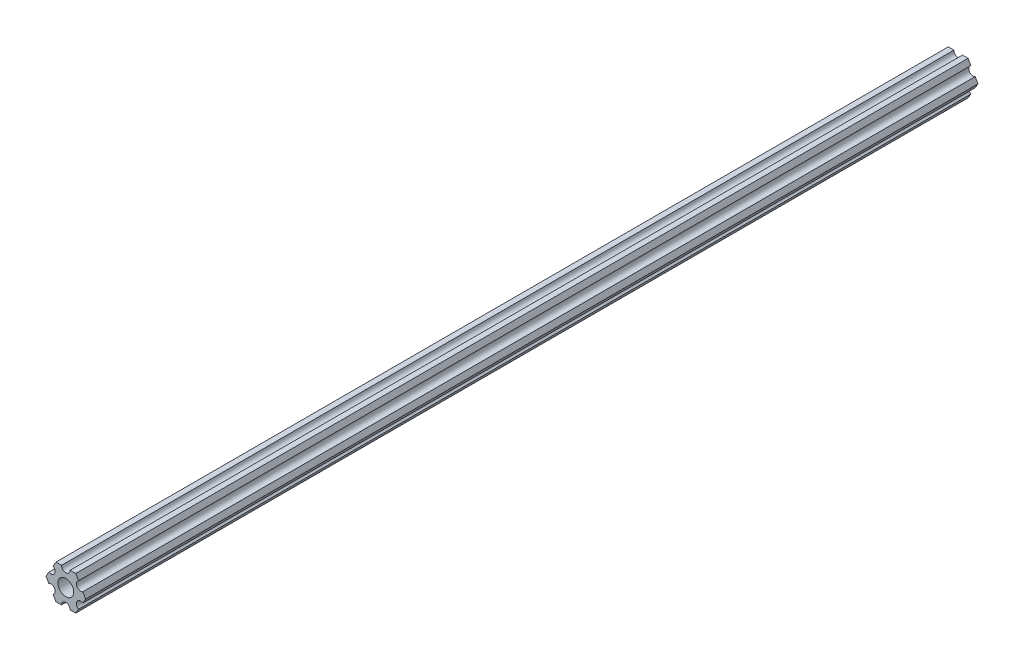
ISO-10303-21;
HEADER;
FILE_DESCRIPTION(('STEP AP214'),'2;1');
FILE_NAME('part.step','',(''),(''),'','','');
FILE_SCHEMA(('AUTOMOTIVE_DESIGN { 1 0 10303 214 1 1 1 1 }'));
ENDSEC;
DATA;
#1=APPLICATION_CONTEXT('core data for automotive mechanical design processes');
#2=APPLICATION_PROTOCOL_DEFINITION('international standard','automotive_design',2000,#1);
#3=PRODUCT_CONTEXT('',#1,'mechanical');
#4=PRODUCT('Part','Part','',(#3));
#5=PRODUCT_RELATED_PRODUCT_CATEGORY('part','',(#4));
#6=PRODUCT_DEFINITION_FORMATION('','',#4);
#7=PRODUCT_DEFINITION_CONTEXT('part definition',#1,'design');
#8=PRODUCT_DEFINITION('design','',#6,#7);
#9=PRODUCT_DEFINITION_SHAPE('','',#8);
#10=(LENGTH_UNIT() NAMED_UNIT(*) SI_UNIT(.MILLI.,.METRE.));
#11=(NAMED_UNIT(*) PLANE_ANGLE_UNIT() SI_UNIT($,.RADIAN.));
#12=(NAMED_UNIT(*) SI_UNIT($,.STERADIAN.) SOLID_ANGLE_UNIT());
#13=UNCERTAINTY_MEASURE_WITH_UNIT(LENGTH_MEASURE(1.E-05),#10,'distance_accuracy_value','');
#14=(GEOMETRIC_REPRESENTATION_CONTEXT(3) GLOBAL_UNCERTAINTY_ASSIGNED_CONTEXT((#13)) GLOBAL_UNIT_ASSIGNED_CONTEXT((#10,
#11,#12)) REPRESENTATION_CONTEXT('',''));
#15=CARTESIAN_POINT('',(0.,0.,0.));
#16=DIRECTION('',(0.,0.,1.));
#17=DIRECTION('',(1.,0.,0.));
#18=AXIS2_PLACEMENT_3D('',#15,#16,#17);
#19=CARTESIAN_POINT('',(3.66617459405346,-6.34999977789375,304.8));
#20=DIRECTION('',(-0.86602543407573,0.499999947533941,0.));
#21=DIRECTION('',(0.,0.,1.));
#22=AXIS2_PLACEMENT_3D('',#19,#20,#21);
#23=PLANE('',#22);
#24=DIRECTION('',(-0.499999947533941,-0.86602543407573,0.));
#25=VECTOR('',#24,1.);
#26=CARTESIAN_POINT('',(3.66617459405346,-6.34999977789375,292.1));
#27=LINE('',#26,#25);
#28=CARTESIAN_POINT('',(4.70551158967065,-4.54981504343587,292.1));
#29=VERTEX_POINT('',#28);
#30=CARTESIAN_POINT('',(3.66617459405348,-6.34999977789375,292.1));
#31=VERTEX_POINT('',#30);
#32=EDGE_CURVE('E395',#29,#31,#27,.T.);
#33=ORIENTED_EDGE('',*,*,#32,.F.);
#34=DIRECTION('',(0.,0.,-1.));
#35=VECTOR('',#34,1.);
#36=CARTESIAN_POINT('',(4.70551158967065,-4.54981504343587,304.8));
#37=LINE('',#36,#35);
#38=CARTESIAN_POINT('',(4.70551158967065,-4.54981504343587,622.3));
#39=VERTEX_POINT('',#38);
#40=EDGE_CURVE('E318',#39,#29,#37,.T.);
#41=ORIENTED_EDGE('',*,*,#40,.F.);
#42=DIRECTION('',(0.499999947533941,0.86602543407573,0.));
#43=VECTOR('',#42,1.);
#44=CARTESIAN_POINT('',(3.66617459405346,-6.34999977789375,622.3));
#45=LINE('',#44,#43);
#46=CARTESIAN_POINT('',(3.66617459405348,-6.34999977789375,622.3));
#47=VERTEX_POINT('',#46);
#48=EDGE_CURVE('E284',#47,#39,#45,.T.);
#49=ORIENTED_EDGE('',*,*,#48,.F.);
#50=DIRECTION('',(0.,0.,-1.));
#51=VECTOR('',#50,1.);
#52=CARTESIAN_POINT('',(3.66617459405346,-6.34999977789375,304.8));
#53=LINE('',#52,#51);
#54=EDGE_CURVE('E234',#47,#31,#53,.T.);
#55=ORIENTED_EDGE('',*,*,#54,.T.);
#56=EDGE_LOOP('',(#33,#41,#49,#55));
#57=FACE_BOUND('',#56,.T.);
#58=ADVANCED_FACE('F42',(#57),#23,.F.);
#59=CARTESIAN_POINT('',(1.58750038469926,-6.34999990382518,304.8));
#60=DIRECTION('',(-6.05825721258438E-08,1.,0.));
#61=DIRECTION('',(0.,0.,1.));
#62=AXIS2_PLACEMENT_3D('',#59,#60,#61);
#63=PLANE('',#62);
#64=DIRECTION('',(-0.999999999999998,-6.05825721258437E-08,0.));
#65=VECTOR('',#64,1.);
#66=CARTESIAN_POINT('',(1.58750038469926,-6.34999990382518,292.1));
#67=LINE('',#66,#65);
#68=CARTESIAN_POINT('',(1.58750038469926,-6.34999990382518,292.1));
#69=VERTEX_POINT('',#68);
#70=EDGE_CURVE('E394',#31,#69,#67,.T.);
#71=ORIENTED_EDGE('',*,*,#70,.F.);
#72=ORIENTED_EDGE('',*,*,#54,.F.);
#73=DIRECTION('',(0.999999999999998,6.05825721258437E-08,0.));
#74=VECTOR('',#73,1.);
#75=CARTESIAN_POINT('',(1.58750038469926,-6.34999990382518,622.3));
#76=LINE('',#75,#74);
#77=CARTESIAN_POINT('',(1.58750038469926,-6.35,622.3));
#78=VERTEX_POINT('',#77);
#79=EDGE_CURVE('E263',#78,#47,#76,.T.);
#80=ORIENTED_EDGE('',*,*,#79,.F.);
#81=DIRECTION('',(0.,0.,-1.));
#82=VECTOR('',#81,1.);
#83=CARTESIAN_POINT('',(1.58750038469926,-6.34999990382518,304.8));
#84=LINE('',#83,#82);
#85=EDGE_CURVE('E231',#78,#69,#84,.T.);
#86=ORIENTED_EDGE('',*,*,#85,.T.);
#87=EDGE_LOOP('',(#71,#72,#80,#86));
#88=FACE_BOUND('',#87,.T.);
#89=ADVANCED_FACE('F355',(#88),#63,.F.);
#90=CARTESIAN_POINT('',(3.8469926204343E-07,-6.35,304.8));
#91=DIRECTION('',(0.,0.,-1.));
#92=DIRECTION('',(-1.,0.,0.));
#93=AXIS2_PLACEMENT_3D('',#90,#91,#92);
#94=CYLINDRICAL_SURFACE('',#93,1.5875);
#95=CARTESIAN_POINT('',(3.8469926204343E-07,-6.35,292.1));
#96=DIRECTION('',(0.,0.,-1.));
#97=DIRECTION('',(-1.,0.,0.));
#98=AXIS2_PLACEMENT_3D('',#95,#96,#97);
#99=CIRCLE('',#98,1.5875);
#100=CARTESIAN_POINT('',(-1.58749961530074,-6.35000009617482,292.1));
#101=VERTEX_POINT('',#100);
#102=EDGE_CURVE('E268',#69,#101,#99,.F.);
#103=ORIENTED_EDGE('',*,*,#102,.F.);
#104=ORIENTED_EDGE('',*,*,#85,.F.);
#105=CARTESIAN_POINT('',(3.8469926204343E-07,-6.35,622.3));
#106=DIRECTION('',(0.,0.,1.));
#107=DIRECTION('',(1.,0.,0.));
#108=AXIS2_PLACEMENT_3D('',#105,#106,#107);
#109=CIRCLE('',#108,1.5875);
#110=CARTESIAN_POINT('',(-1.58749961530074,-6.35000009617482,622.3));
#111=VERTEX_POINT('',#110);
#112=EDGE_CURVE('E309',#111,#78,#109,.F.);
#113=ORIENTED_EDGE('',*,*,#112,.F.);
#114=DIRECTION('',(0.,0.,-1.));
#115=VECTOR('',#114,1.);
#116=CARTESIAN_POINT('',(-1.58749961530073,-6.35000009617482,304.8));
#117=LINE('',#116,#115);
#118=EDGE_CURVE('E228',#111,#101,#117,.T.);
#119=ORIENTED_EDGE('',*,*,#118,.T.);
#120=EDGE_LOOP('',(#103,#104,#113,#119));
#121=FACE_BOUND('',#120,.T.);
#122=ADVANCED_FACE('F361',(#121),#94,.F.);
#123=CARTESIAN_POINT('',(-3.66617382465481,-6.35000022210628,304.8));
#124=DIRECTION('',(-6.05825854783851E-08,1.,0.));
#125=DIRECTION('',(0.,0.,1.));
#126=AXIS2_PLACEMENT_3D('',#123,#124,#125);
#127=PLANE('',#126);
#128=DIRECTION('',(-0.999999999999998,-6.0582585478385E-08,0.));
#129=VECTOR('',#128,1.);
#130=CARTESIAN_POINT('',(-3.66617382465481,-6.35000022210628,292.1));
#131=LINE('',#130,#129);
#132=CARTESIAN_POINT('',(-3.6661738246548,-6.35000022210629,292.1));
#133=VERTEX_POINT('',#132);
#134=EDGE_CURVE('E273',#101,#133,#131,.T.);
#135=ORIENTED_EDGE('',*,*,#134,.F.);
#136=ORIENTED_EDGE('',*,*,#118,.F.);
#137=DIRECTION('',(0.999999999999998,6.0582585478385E-08,0.));
#138=VECTOR('',#137,1.);
#139=CARTESIAN_POINT('',(-3.66617382465481,-6.35000022210628,622.3));
#140=LINE('',#139,#138);
#141=CARTESIAN_POINT('',(-3.6661738246548,-6.35000022210629,622.3));
#142=VERTEX_POINT('',#141);
#143=EDGE_CURVE('E307',#142,#111,#140,.T.);
#144=ORIENTED_EDGE('',*,*,#143,.F.);
#145=DIRECTION('',(0.,0.,-1.));
#146=VECTOR('',#145,1.);
#147=CARTESIAN_POINT('',(-3.66617382465481,-6.35000022210628,304.8));
#148=LINE('',#147,#146);
#149=EDGE_CURVE('E225',#142,#133,#148,.T.);
#150=ORIENTED_EDGE('',*,*,#149,.T.);
#151=EDGE_LOOP('',(#135,#136,#144,#150));
#152=FACE_BOUND('',#151,.T.);
#153=ADVANCED_FACE('F372',(#152),#127,.F.);
#154=CARTESIAN_POINT('',(-4.70551103839172,-4.54981561357972,304.8));
#155=DIRECTION('',(0.866025373493152,0.500000052466045,0.));
#156=DIRECTION('',(0.,0.,-1.));
#157=AXIS2_PLACEMENT_3D('',#154,#155,#156);
#158=PLANE('',#157);
#159=DIRECTION('',(-0.500000052466045,0.866025373493152,0.));
#160=VECTOR('',#159,1.);
#161=CARTESIAN_POINT('',(-4.70551103839172,-4.54981561357972,292.1));
#162=LINE('',#161,#160);
#163=CARTESIAN_POINT('',(-4.70551103839172,-4.54981561357972,292.1));
#164=VERTEX_POINT('',#163);
#165=EDGE_CURVE('E277',#133,#164,#162,.T.);
#166=ORIENTED_EDGE('',*,*,#165,.F.);
#167=ORIENTED_EDGE('',*,*,#149,.F.);
#168=DIRECTION('',(0.500000052466045,-0.866025373493152,0.));
#169=VECTOR('',#168,1.);
#170=CARTESIAN_POINT('',(-4.70551103839172,-4.54981561357972,622.3));
#171=LINE('',#170,#169);
#172=CARTESIAN_POINT('',(-4.70551103839172,-4.54981561357972,622.3));
#173=VERTEX_POINT('',#172);
#174=EDGE_CURVE('E305',#173,#142,#171,.T.);
#175=ORIENTED_EDGE('',*,*,#174,.F.);
#176=DIRECTION('',(0.,0.,-1.));
#177=VECTOR('',#176,1.);
#178=CARTESIAN_POINT('',(-4.70551103839172,-4.54981561357972,304.8));
#179=LINE('',#178,#177);
#180=EDGE_CURVE('E217',#173,#164,#179,.T.);
#181=ORIENTED_EDGE('',*,*,#180,.T.);
#182=EDGE_LOOP('',(#166,#167,#175,#181));
#183=FACE_BOUND('',#182,.T.);
#184=ADVANCED_FACE('F44',(#183),#158,.F.);
#185=CARTESIAN_POINT('',(-5.49926112168156,-3.17500033315934,304.8));
#186=DIRECTION('',(0.,0.,-1.));
#187=DIRECTION('',(-1.,0.,0.));
#188=AXIS2_PLACEMENT_3D('',#185,#186,#187);
#189=CYLINDRICAL_SURFACE('',#188,1.5875);
#190=CARTESIAN_POINT('',(-5.49926112168156,-3.17500033315934,292.1));
#191=DIRECTION('',(0.,0.,-1.));
#192=DIRECTION('',(-1.,0.,0.));
#193=AXIS2_PLACEMENT_3D('',#190,#191,#192);
#194=CIRCLE('',#193,1.5875);
#195=CARTESIAN_POINT('',(-6.29301120497142,-1.80018505273897,292.1));
#196=VERTEX_POINT('',#195);
#197=EDGE_CURVE('E196',#164,#196,#194,.F.);
#198=ORIENTED_EDGE('',*,*,#197,.F.);
#199=ORIENTED_EDGE('',*,*,#180,.F.);
#200=CARTESIAN_POINT('',(-5.49926112168156,-3.17500033315934,622.3));
#201=DIRECTION('',(0.,0.,1.));
#202=DIRECTION('',(1.,0.,0.));
#203=AXIS2_PLACEMENT_3D('',#200,#201,#202);
#204=CIRCLE('',#203,1.5875);
#205=CARTESIAN_POINT('',(-6.29301120497142,-1.80018505273897,622.3));
#206=VERTEX_POINT('',#205);
#207=EDGE_CURVE('E303',#206,#173,#204,.F.);
#208=ORIENTED_EDGE('',*,*,#207,.F.);
#209=DIRECTION('',(0.,0.,-1.));
#210=VECTOR('',#209,1.);
#211=CARTESIAN_POINT('',(-6.29301120497141,-1.80018505273897,304.8));
#212=LINE('',#211,#210);
#213=EDGE_CURVE('E215',#206,#196,#212,.T.);
#214=ORIENTED_EDGE('',*,*,#213,.T.);
#215=EDGE_LOOP('',(#198,#199,#208,#214));
#216=FACE_BOUND('',#215,.T.);
#217=ADVANCED_FACE('F379',(#216),#189,.F.);
#218=CARTESIAN_POINT('',(-7.33234841870827,-4.44212523790841E-07,304.8));
#219=DIRECTION('',(0.866025373493151,0.500000052466045,0.));
#220=DIRECTION('',(0.,0.,-1.));
#221=AXIS2_PLACEMENT_3D('',#218,#219,#220);
#222=PLANE('',#221);
#223=DIRECTION('',(-0.500000052466045,0.866025373493151,0.));
#224=VECTOR('',#223,1.);
#225=CARTESIAN_POINT('',(-7.33234841870827,-4.44212523790841E-07,292.1));
#226=LINE('',#225,#224);
#227=CARTESIAN_POINT('',(-7.33234841870827,-4.44212537413502E-07,292.1));
#228=VERTEX_POINT('',#227);
#229=EDGE_CURVE('E190',#196,#228,#226,.T.);
#230=ORIENTED_EDGE('',*,*,#229,.F.);
#231=ORIENTED_EDGE('',*,*,#213,.F.);
#232=DIRECTION('',(0.500000052466045,-0.866025373493151,0.));
#233=VECTOR('',#232,1.);
#234=CARTESIAN_POINT('',(-7.33234841870827,-4.44212523790841E-07,622.3));
#235=LINE('',#234,#233);
#236=CARTESIAN_POINT('',(-7.33234841870827,-4.44212537413502E-07,622.3));
#237=VERTEX_POINT('',#236);
#238=EDGE_CURVE('E214',#237,#206,#235,.T.);
#239=ORIENTED_EDGE('',*,*,#238,.F.);
#240=DIRECTION('',(0.,0.,-1.));
#241=VECTOR('',#240,1.);
#242=CARTESIAN_POINT('',(-7.33234841870827,-4.44212523790841E-07,304.8));
#243=LINE('',#242,#241);
#244=EDGE_CURVE('E207',#237,#228,#243,.T.);
#245=ORIENTED_EDGE('',*,*,#244,.T.);
#246=EDGE_LOOP('',(#230,#231,#239,#245));
#247=FACE_BOUND('',#246,.T.);
#248=ADVANCED_FACE('F213',(#247),#222,.F.);
#249=CARTESIAN_POINT('',(-6.29301142309098,1.80018429024547,304.8));
#250=DIRECTION('',(0.866025434075724,-0.499999947533952,0.));
#251=DIRECTION('',(0.,0.,-1.));
#252=AXIS2_PLACEMENT_3D('',#249,#250,#251);
#253=PLANE('',#252);
#254=DIRECTION('',(0.499999947533952,0.866025434075724,0.));
#255=VECTOR('',#254,1.);
#256=CARTESIAN_POINT('',(-6.29301142309098,1.80018429024547,292.1));
#257=LINE('',#256,#255);
#258=CARTESIAN_POINT('',(-6.29301142309098,1.80018429024547,292.1));
#259=VERTEX_POINT('',#258);
#260=EDGE_CURVE('E193',#228,#259,#257,.T.);
#261=ORIENTED_EDGE('',*,*,#260,.F.);
#262=ORIENTED_EDGE('',*,*,#244,.F.);
#263=DIRECTION('',(-0.499999947533952,-0.866025434075724,0.));
#264=VECTOR('',#263,1.);
#265=CARTESIAN_POINT('',(-6.29301142309098,1.80018429024547,622.3));
#266=LINE('',#265,#264);
#267=CARTESIAN_POINT('',(-6.29301142309098,1.80018429024547,622.3));
#268=VERTEX_POINT('',#267);
#269=EDGE_CURVE('E300',#268,#237,#266,.T.);
#270=ORIENTED_EDGE('',*,*,#269,.F.);
#271=DIRECTION('',(0.,0.,-1.));
#272=VECTOR('',#271,1.);
#273=CARTESIAN_POINT('',(-6.29301142309098,1.80018429024547,304.8));
#274=LINE('',#273,#272);
#275=EDGE_CURVE('E209',#268,#259,#274,.T.);
#276=ORIENTED_EDGE('',*,*,#275,.T.);
#277=EDGE_LOOP('',(#261,#262,#270,#276));
#278=FACE_BOUND('',#277,.T.);
#279=ADVANCED_FACE('F205',(#278),#253,.F.);
#280=CARTESIAN_POINT('',(-5.49926150638082,3.17499966684067,304.8));
#281=DIRECTION('',(0.,0.,-1.));
#282=DIRECTION('',(-1.,0.,0.));
#283=AXIS2_PLACEMENT_3D('',#280,#281,#282);
#284=CYLINDRICAL_SURFACE('',#283,1.5875);
#285=CARTESIAN_POINT('',(-5.49926150638082,3.17499966684067,292.1));
#286=DIRECTION('',(0.,0.,-1.));
#287=DIRECTION('',(-1.,0.,0.));
#288=AXIS2_PLACEMENT_3D('',#285,#286,#287);
#289=CIRCLE('',#288,1.5875);
#290=CARTESIAN_POINT('',(-4.70551158967065,4.54981504343587,292.1));
#291=VERTEX_POINT('',#290);
#292=EDGE_CURVE('E210',#259,#291,#289,.F.);
#293=ORIENTED_EDGE('',*,*,#292,.F.);
#294=ORIENTED_EDGE('',*,*,#275,.F.);
#295=CARTESIAN_POINT('',(-5.49926150638082,3.17499966684067,622.3));
#296=DIRECTION('',(0.,0.,1.));
#297=DIRECTION('',(1.,0.,0.));
#298=AXIS2_PLACEMENT_3D('',#295,#296,#297);
#299=CIRCLE('',#298,1.5875);
#300=CARTESIAN_POINT('',(-4.70551158967065,4.54981504343587,622.3));
#301=VERTEX_POINT('',#300);
#302=EDGE_CURVE('E298',#301,#268,#299,.F.);
#303=ORIENTED_EDGE('',*,*,#302,.F.);
#304=DIRECTION('',(0.,0.,-1.));
#305=VECTOR('',#304,1.);
#306=CARTESIAN_POINT('',(-4.70551158967065,4.54981504343587,304.8));
#307=LINE('',#306,#305);
#308=EDGE_CURVE('E219',#301,#291,#307,.T.);
#309=ORIENTED_EDGE('',*,*,#308,.T.);
#310=EDGE_LOOP('',(#293,#294,#303,#309));
#311=FACE_BOUND('',#310,.T.);
#312=ADVANCED_FACE('F444',(#311),#284,.F.);
#313=CARTESIAN_POINT('',(-3.66617459405349,6.3499997778937,304.8));
#314=DIRECTION('',(0.866025434075729,-0.499999947533942,0.));
#315=DIRECTION('',(0.,0.,-1.));
#316=AXIS2_PLACEMENT_3D('',#313,#314,#315);
#317=PLANE('',#316);
#318=DIRECTION('',(0.499999947533942,0.866025434075729,0.));
#319=VECTOR('',#318,1.);
#320=CARTESIAN_POINT('',(-3.66617459405349,6.3499997778937,292.1));
#321=LINE('',#320,#319);
#322=CARTESIAN_POINT('',(-3.66617459405357,6.3499997778937,292.1));
#323=VERTEX_POINT('',#322);
#324=EDGE_CURVE('E442',#291,#323,#321,.T.);
#325=ORIENTED_EDGE('',*,*,#324,.F.);
#326=ORIENTED_EDGE('',*,*,#308,.F.);
#327=DIRECTION('',(-0.499999947533942,-0.866025434075729,0.));
#328=VECTOR('',#327,1.);
#329=CARTESIAN_POINT('',(-3.66617459405349,6.3499997778937,622.3));
#330=LINE('',#329,#328);
#331=CARTESIAN_POINT('',(-3.66617459405357,6.3499997778937,622.3));
#332=VERTEX_POINT('',#331);
#333=EDGE_CURVE('E296',#332,#301,#330,.T.);
#334=ORIENTED_EDGE('',*,*,#333,.F.);
#335=DIRECTION('',(0.,0.,-1.));
#336=VECTOR('',#335,1.);
#337=CARTESIAN_POINT('',(-3.66617459405349,6.3499997778937,304.8));
#338=LINE('',#337,#336);
#339=EDGE_CURVE('E312',#332,#323,#338,.T.);
#340=ORIENTED_EDGE('',*,*,#339,.T.);
#341=EDGE_LOOP('',(#325,#326,#334,#340));
#342=FACE_BOUND('',#341,.T.);
#343=ADVANCED_FACE('F441',(#342),#317,.F.);
#344=CARTESIAN_POINT('',(-1.58750038469926,6.34999990382518,304.8));
#345=DIRECTION('',(6.05825963273174E-08,-1.,0.));
#346=DIRECTION('',(0.,0.,-1.));
#347=AXIS2_PLACEMENT_3D('',#344,#345,#346);
#348=PLANE('',#347);
#349=DIRECTION('',(0.999999999999998,6.05825963273173E-08,0.));
#350=VECTOR('',#349,1.);
#351=CARTESIAN_POINT('',(-1.58750038469926,6.34999990382518,292.1));
#352=LINE('',#351,#350);
#353=CARTESIAN_POINT('',(-1.58750038469926,6.35,292.1));
#354=VERTEX_POINT('',#353);
#355=EDGE_CURVE('E435',#323,#354,#352,.T.);
#356=ORIENTED_EDGE('',*,*,#355,.F.);
#357=ORIENTED_EDGE('',*,*,#339,.F.);
#358=DIRECTION('',(-0.999999999999998,-6.05825963273173E-08,0.));
#359=VECTOR('',#358,1.);
#360=CARTESIAN_POINT('',(-1.58750038469926,6.34999990382518,622.3));
#361=LINE('',#360,#359);
#362=CARTESIAN_POINT('',(-1.58750038469926,6.34999990382519,622.3));
#363=VERTEX_POINT('',#362);
#364=EDGE_CURVE('E294',#363,#332,#361,.T.);
#365=ORIENTED_EDGE('',*,*,#364,.F.);
#366=DIRECTION('',(0.,0.,-1.));
#367=VECTOR('',#366,1.);
#368=CARTESIAN_POINT('',(-1.58750038469926,6.34999990382519,304.8));
#369=LINE('',#368,#367);
#370=EDGE_CURVE('E315',#363,#354,#369,.T.);
#371=ORIENTED_EDGE('',*,*,#370,.T.);
#372=EDGE_LOOP('',(#356,#357,#365,#371));
#373=FACE_BOUND('',#372,.T.);
#374=ADVANCED_FACE('F433',(#373),#348,.F.);
#375=CARTESIAN_POINT('',(-3.84699260060323E-07,6.35,304.8));
#376=DIRECTION('',(0.,0.,-1.));
#377=DIRECTION('',(-1.,0.,0.));
#378=AXIS2_PLACEMENT_3D('',#375,#376,#377);
#379=CYLINDRICAL_SURFACE('',#378,1.5875);
#380=CARTESIAN_POINT('',(-3.84699260060323E-07,6.35,292.1));
#381=DIRECTION('',(0.,0.,-1.));
#382=DIRECTION('',(-1.,0.,0.));
#383=AXIS2_PLACEMENT_3D('',#380,#381,#382);
#384=CIRCLE('',#383,1.5875);
#385=CARTESIAN_POINT('',(1.58749961530074,6.35000009617481,292.1));
#386=VERTEX_POINT('',#385);
#387=EDGE_CURVE('E430',#354,#386,#384,.F.);
#388=ORIENTED_EDGE('',*,*,#387,.F.);
#389=ORIENTED_EDGE('',*,*,#370,.F.);
#390=CARTESIAN_POINT('',(-3.84699260060323E-07,6.35,622.3));
#391=DIRECTION('',(0.,0.,1.));
#392=DIRECTION('',(1.,0.,0.));
#393=AXIS2_PLACEMENT_3D('',#390,#391,#392);
#394=CIRCLE('',#393,1.5875);
#395=CARTESIAN_POINT('',(1.58749961530074,6.35000009617481,622.3));
#396=VERTEX_POINT('',#395);
#397=EDGE_CURVE('E292',#396,#363,#394,.F.);
#398=ORIENTED_EDGE('',*,*,#397,.F.);
#399=DIRECTION('',(0.,0.,-1.));
#400=VECTOR('',#399,1.);
#401=CARTESIAN_POINT('',(1.58749961530074,6.35000009617482,304.8));
#402=LINE('',#401,#400);
#403=EDGE_CURVE('E325',#396,#386,#402,.T.);
#404=ORIENTED_EDGE('',*,*,#403,.T.);
#405=EDGE_LOOP('',(#388,#389,#398,#404));
#406=FACE_BOUND('',#405,.T.);
#407=ADVANCED_FACE('F429',(#406),#379,.F.);
#408=CARTESIAN_POINT('',(3.66617382465481,6.35000022210627,304.8));
#409=DIRECTION('',(6.05825850611185E-08,-1.,0.));
#410=DIRECTION('',(0.,0.,-1.));
#411=AXIS2_PLACEMENT_3D('',#408,#409,#410);
#412=PLANE('',#411);
#413=DIRECTION('',(0.999999999999998,6.05825850611184E-08,0.));
#414=VECTOR('',#413,1.);
#415=CARTESIAN_POINT('',(3.66617382465481,6.35000022210627,292.1));
#416=LINE('',#415,#414);
#417=CARTESIAN_POINT('',(3.66617382465479,6.35000022210629,292.1));
#418=VERTEX_POINT('',#417);
#419=EDGE_CURVE('E423',#386,#418,#416,.T.);
#420=ORIENTED_EDGE('',*,*,#419,.F.);
#421=ORIENTED_EDGE('',*,*,#403,.F.);
#422=DIRECTION('',(-0.999999999999998,-6.05825850611184E-08,0.));
#423=VECTOR('',#422,1.);
#424=CARTESIAN_POINT('',(3.66617382465481,6.35000022210627,622.3));
#425=LINE('',#424,#423);
#426=CARTESIAN_POINT('',(3.66617382465479,6.35000022210629,622.3));
#427=VERTEX_POINT('',#426);
#428=EDGE_CURVE('E290',#427,#396,#425,.T.);
#429=ORIENTED_EDGE('',*,*,#428,.F.);
#430=DIRECTION('',(0.,0.,-1.));
#431=VECTOR('',#430,1.);
#432=CARTESIAN_POINT('',(3.66617382465481,6.35000022210627,304.8));
#433=LINE('',#432,#431);
#434=EDGE_CURVE('E223',#427,#418,#433,.T.);
#435=ORIENTED_EDGE('',*,*,#434,.T.);
#436=EDGE_LOOP('',(#420,#421,#429,#435));
#437=FACE_BOUND('',#436,.T.);
#438=ADVANCED_FACE('F421',(#437),#412,.F.);
#439=CARTESIAN_POINT('',(4.70551103839172,4.54981561357972,304.8));
#440=DIRECTION('',(-0.866025373493151,-0.500000052466046,0.));
#441=DIRECTION('',(-0.500000052466046,0.866025373493151,0.));
#442=AXIS2_PLACEMENT_3D('',#439,#440,#441);
#443=PLANE('',#442);
#444=DIRECTION('',(0.500000052466046,-0.866025373493151,0.));
#445=VECTOR('',#444,1.);
#446=CARTESIAN_POINT('',(4.70551103839172,4.54981561357972,292.1));
#447=LINE('',#446,#445);
#448=CARTESIAN_POINT('',(4.70551103839172,4.54981561357972,292.1));
#449=VERTEX_POINT('',#448);
#450=EDGE_CURVE('E418',#418,#449,#447,.T.);
#451=ORIENTED_EDGE('',*,*,#450,.F.);
#452=ORIENTED_EDGE('',*,*,#434,.F.);
#453=DIRECTION('',(-0.500000052466046,0.866025373493151,0.));
#454=VECTOR('',#453,1.);
#455=CARTESIAN_POINT('',(4.70551103839172,4.54981561357972,622.3));
#456=LINE('',#455,#454);
#457=CARTESIAN_POINT('',(4.70551103839172,4.54981561357972,622.3));
#458=VERTEX_POINT('',#457);
#459=EDGE_CURVE('E288',#458,#427,#456,.T.);
#460=ORIENTED_EDGE('',*,*,#459,.F.);
#461=DIRECTION('',(0.,0.,-1.));
#462=VECTOR('',#461,1.);
#463=CARTESIAN_POINT('',(4.70551103839172,4.54981561357972,304.8));
#464=LINE('',#463,#462);
#465=EDGE_CURVE('E238',#458,#449,#464,.T.);
#466=ORIENTED_EDGE('',*,*,#465,.T.);
#467=EDGE_LOOP('',(#451,#452,#460,#466));
#468=FACE_BOUND('',#467,.T.);
#469=ADVANCED_FACE('F416',(#468),#443,.F.);
#470=CARTESIAN_POINT('',(7.33234841870827,4.44212519169686E-07,304.8));
#471=DIRECTION('',(-0.866025373493145,-0.500000052466057,0.));
#472=DIRECTION('',(-0.500000052466057,0.866025373493145,0.));
#473=AXIS2_PLACEMENT_3D('',#470,#471,#472);
#474=PLANE('',#473);
#475=DIRECTION('',(0.500000052466057,-0.866025373493145,0.));
#476=VECTOR('',#475,1.);
#477=CARTESIAN_POINT('',(7.33234841870827,4.44212519169686E-07,292.1));
#478=LINE('',#477,#476);
#479=CARTESIAN_POINT('',(6.2930112049714,1.80018505273894,292.1));
#480=VERTEX_POINT('',#479);
#481=CARTESIAN_POINT('',(7.33234841870827,4.4421253654614E-07,292.1));
#482=VERTEX_POINT('',#481);
#483=EDGE_CURVE('E405',#480,#482,#478,.T.);
#484=ORIENTED_EDGE('',*,*,#483,.F.);
#485=DIRECTION('',(0.,0.,-1.));
#486=VECTOR('',#485,1.);
#487=CARTESIAN_POINT('',(6.29301120497139,1.80018505273894,304.8));
#488=LINE('',#487,#486);
#489=CARTESIAN_POINT('',(6.2930112049714,1.80018505273894,622.3));
#490=VERTEX_POINT('',#489);
#491=EDGE_CURVE('E237',#490,#480,#488,.T.);
#492=ORIENTED_EDGE('',*,*,#491,.F.);
#493=DIRECTION('',(-0.500000052466057,0.866025373493145,0.));
#494=VECTOR('',#493,1.);
#495=CARTESIAN_POINT('',(7.33234841870827,4.44212519169686E-07,622.3));
#496=LINE('',#495,#494);
#497=CARTESIAN_POINT('',(7.33234841870827,4.4421253654614E-07,622.3));
#498=VERTEX_POINT('',#497);
#499=EDGE_CURVE('E282',#498,#490,#496,.T.);
#500=ORIENTED_EDGE('',*,*,#499,.F.);
#501=DIRECTION('',(0.,0.,-1.));
#502=VECTOR('',#501,1.);
#503=CARTESIAN_POINT('',(7.33234841870827,4.44212519169686E-07,304.8));
#504=LINE('',#503,#502);
#505=EDGE_CURVE('E235',#498,#482,#504,.T.);
#506=ORIENTED_EDGE('',*,*,#505,.T.);
#507=EDGE_LOOP('',(#484,#492,#500,#506));
#508=FACE_BOUND('',#507,.T.);
#509=ADVANCED_FACE('F370',(#508),#474,.F.);
#510=CARTESIAN_POINT('',(6.29301142309098,-1.80018429024546,304.8));
#511=DIRECTION('',(-0.866025434075723,0.499999947533953,0.));
#512=DIRECTION('',(0.,0.,1.));
#513=AXIS2_PLACEMENT_3D('',#510,#511,#512);
#514=PLANE('',#513);
#515=DIRECTION('',(-0.499999947533953,-0.866025434075723,0.));
#516=VECTOR('',#515,1.);
#517=CARTESIAN_POINT('',(6.29301142309098,-1.80018429024546,292.1));
#518=LINE('',#517,#516);
#519=CARTESIAN_POINT('',(6.29301142309098,-1.80018429024546,292.1));
#520=VERTEX_POINT('',#519);
#521=EDGE_CURVE('E57',#482,#520,#518,.T.);
#522=ORIENTED_EDGE('',*,*,#521,.F.);
#523=ORIENTED_EDGE('',*,*,#505,.F.);
#524=DIRECTION('',(0.499999947533953,0.866025434075723,0.));
#525=VECTOR('',#524,1.);
#526=CARTESIAN_POINT('',(6.29301142309098,-1.80018429024546,622.3));
#527=LINE('',#526,#525);
#528=CARTESIAN_POINT('',(6.29301142309098,-1.80018429024546,622.3));
#529=VERTEX_POINT('',#528);
#530=EDGE_CURVE('E271',#529,#498,#527,.T.);
#531=ORIENTED_EDGE('',*,*,#530,.F.);
#532=DIRECTION('',(0.,0.,-1.));
#533=VECTOR('',#532,1.);
#534=CARTESIAN_POINT('',(6.29301142309098,-1.80018429024546,304.8));
#535=LINE('',#534,#533);
#536=EDGE_CURVE('E244',#529,#520,#535,.T.);
#537=ORIENTED_EDGE('',*,*,#536,.T.);
#538=EDGE_LOOP('',(#522,#523,#531,#537));
#539=FACE_BOUND('',#538,.T.);
#540=ADVANCED_FACE('F368',(#539),#514,.F.);
#541=CARTESIAN_POINT('',(5.49926112168156,3.17500033315934,304.8));
#542=DIRECTION('',(0.,0.,-1.));
#543=DIRECTION('',(-1.,0.,0.));
#544=AXIS2_PLACEMENT_3D('',#541,#542,#543);
#545=CYLINDRICAL_SURFACE('',#544,1.5875);
#546=CARTESIAN_POINT('',(5.49926112168156,3.17500033315934,292.1));
#547=DIRECTION('',(0.,0.,-1.));
#548=DIRECTION('',(-1.,0.,0.));
#549=AXIS2_PLACEMENT_3D('',#546,#547,#548);
#550=CIRCLE('',#549,1.5875);
#551=CARTESIAN_POINT('',(3.91176112168156,3.17500033315934,292.1));
#552=VERTEX_POINT('',#551);
#553=EDGE_CURVE('E408',#552,#480,#550,.F.);
#554=ORIENTED_EDGE('',*,*,#553,.F.);
#555=DIRECTION('',(0.,0.,-1.));
#556=VECTOR('',#555,1.);
#557=CARTESIAN_POINT('',(3.91176112168156,3.17500033315934,304.8));
#558=LINE('',#557,#556);
#559=CARTESIAN_POINT('',(3.91176112168156,3.17500033315934,304.8));
#560=VERTEX_POINT('',#559);
#561=EDGE_CURVE('E248',#560,#552,#558,.T.);
#562=ORIENTED_EDGE('',*,*,#561,.F.);
#563=ORIENTED_EDGE('',*,*,#561,.T.);
#564=EDGE_CURVE('E457',#449,#552,#550,.F.);
#565=ORIENTED_EDGE('',*,*,#564,.F.);
#566=ORIENTED_EDGE('',*,*,#465,.F.);
#567=CARTESIAN_POINT('',(5.49926112168156,3.17500033315934,622.3));
#568=DIRECTION('',(0.,0.,1.));
#569=DIRECTION('',(1.,0.,0.));
#570=AXIS2_PLACEMENT_3D('',#567,#568,#569);
#571=CIRCLE('',#570,1.5875);
#572=EDGE_CURVE('E286',#490,#458,#571,.F.);
#573=ORIENTED_EDGE('',*,*,#572,.F.);
#574=ORIENTED_EDGE('',*,*,#491,.T.);
#575=EDGE_LOOP('',(#554,#562,#563,#565,#566,#573,#574));
#576=FACE_BOUND('',#575,.T.);
#577=ADVANCED_FACE('F350',(#576),#545,.F.);
#578=CARTESIAN_POINT('',(5.49926150638082,-3.17499966684067,304.8));
#579=DIRECTION('',(0.,0.,-1.));
#580=DIRECTION('',(-1.,0.,0.));
#581=AXIS2_PLACEMENT_3D('',#578,#579,#580);
#582=CYLINDRICAL_SURFACE('',#581,1.5875);
#583=CARTESIAN_POINT('',(5.49926150638082,-3.17499966684067,292.1));
#584=DIRECTION('',(0.,0.,-1.));
#585=DIRECTION('',(-1.,0.,0.));
#586=AXIS2_PLACEMENT_3D('',#583,#584,#585);
#587=CIRCLE('',#586,1.5875);
#588=CARTESIAN_POINT('',(3.91176150638082,-3.17499966684067,292.1));
#589=VERTEX_POINT('',#588);
#590=EDGE_CURVE('E463',#589,#29,#587,.F.);
#591=ORIENTED_EDGE('',*,*,#590,.F.);
#592=DIRECTION('',(0.,0.,-1.));
#593=VECTOR('',#592,1.);
#594=CARTESIAN_POINT('',(3.91176150638082,-3.17499966684067,304.8));
#595=LINE('',#594,#593);
#596=CARTESIAN_POINT('',(3.91176150638082,-3.17499966684067,304.8));
#597=VERTEX_POINT('',#596);
#598=EDGE_CURVE('E240',#597,#589,#595,.T.);
#599=ORIENTED_EDGE('',*,*,#598,.F.);
#600=ORIENTED_EDGE('',*,*,#598,.T.);
#601=EDGE_CURVE('E398',#520,#589,#587,.F.);
#602=ORIENTED_EDGE('',*,*,#601,.F.);
#603=ORIENTED_EDGE('',*,*,#536,.F.);
#604=CARTESIAN_POINT('',(5.49926150638082,-3.17499966684067,622.3));
#605=DIRECTION('',(0.,0.,1.));
#606=DIRECTION('',(1.,0.,0.));
#607=AXIS2_PLACEMENT_3D('',#604,#605,#606);
#608=CIRCLE('',#607,1.5875);
#609=EDGE_CURVE('E267',#39,#529,#608,.F.);
#610=ORIENTED_EDGE('',*,*,#609,.F.);
#611=ORIENTED_EDGE('',*,*,#40,.T.);
#612=EDGE_LOOP('',(#591,#599,#600,#602,#603,#610,#611));
#613=FACE_BOUND('',#612,.T.);
#614=ADVANCED_FACE('F342',(#613),#582,.F.);
#615=CARTESIAN_POINT('',(0.,0.,304.8));
#616=DIRECTION('',(0.,0.,-1.));
#617=DIRECTION('',(-1.,0.,0.));
#618=AXIS2_PLACEMENT_3D('',#615,#616,#617);
#619=CYLINDRICAL_SURFACE('',#618,2.9337);
#620=CARTESIAN_POINT('',(0.,0.,622.3));
#621=DIRECTION('',(0.,0.,1.));
#622=DIRECTION('',(1.,0.,0.));
#623=AXIS2_PLACEMENT_3D('',#620,#621,#622);
#624=CIRCLE('',#623,2.9337);
#625=CARTESIAN_POINT('',(2.9337,0.,622.3));
#626=VERTEX_POINT('',#625);
#627=EDGE_CURVE('E265',#626,#626,#624,.F.);
#628=ORIENTED_EDGE('',*,*,#627,.F.);
#629=EDGE_LOOP('',(#628));
#630=FACE_BOUND('',#629,.T.);
#631=CARTESIAN_POINT('',(0.,0.,292.1));
#632=DIRECTION('',(0.,0.,-1.));
#633=DIRECTION('',(-1.,0.,0.));
#634=AXIS2_PLACEMENT_3D('',#631,#632,#633);
#635=CIRCLE('',#634,2.9337);
#636=CARTESIAN_POINT('',(-2.9337,0.,292.1));
#637=VERTEX_POINT('',#636);
#638=CARTESIAN_POINT('',(2.9337,0.,292.1));
#639=VERTEX_POINT('',#638);
#640=EDGE_CURVE('E11',#637,#639,#635,.F.);
#641=ORIENTED_EDGE('',*,*,#640,.F.);
#642=DIRECTION('',(0.,0.,-1.));
#643=VECTOR('',#642,1.);
#644=CARTESIAN_POINT('',(-2.9337,0.,304.8));
#645=LINE('',#644,#643);
#646=CARTESIAN_POINT('',(-2.9337,0.,304.8));
#647=VERTEX_POINT('',#646);
#648=EDGE_CURVE('E245',#647,#637,#645,.T.);
#649=ORIENTED_EDGE('',*,*,#648,.F.);
#650=ORIENTED_EDGE('',*,*,#648,.T.);
#651=EDGE_CURVE('E46',#639,#637,#635,.F.);
#652=ORIENTED_EDGE('',*,*,#651,.F.);
#653=DIRECTION('',(0.,0.,-1.));
#654=VECTOR('',#653,1.);
#655=CARTESIAN_POINT('',(2.9337,0.,304.8));
#656=LINE('',#655,#654);
#657=CARTESIAN_POINT('',(2.9337,0.,304.8));
#658=VERTEX_POINT('',#657);
#659=EDGE_CURVE('E257',#658,#639,#656,.T.);
#660=ORIENTED_EDGE('',*,*,#659,.F.);
#661=ORIENTED_EDGE('',*,*,#659,.T.);
#662=EDGE_LOOP('',(#641,#649,#650,#652,#660,#661));
#663=FACE_BOUND('',#662,.T.);
#664=ADVANCED_FACE('F339',(#630,#663),#619,.F.);
#665=CARTESIAN_POINT('',(0.,0.,622.3));
#666=DIRECTION('',(0.,0.,1.));
#667=DIRECTION('',(1.,0.,0.));
#668=AXIS2_PLACEMENT_3D('',#665,#666,#667);
#669=PLANE('',#668);
#670=ORIENTED_EDGE('',*,*,#627,.T.);
#671=EDGE_LOOP('',(#670));
#672=FACE_BOUND('',#671,.T.);
#673=ORIENTED_EDGE('',*,*,#79,.T.);
#674=ORIENTED_EDGE('',*,*,#48,.T.);
#675=ORIENTED_EDGE('',*,*,#609,.T.);
#676=ORIENTED_EDGE('',*,*,#530,.T.);
#677=ORIENTED_EDGE('',*,*,#499,.T.);
#678=ORIENTED_EDGE('',*,*,#572,.T.);
#679=ORIENTED_EDGE('',*,*,#459,.T.);
#680=ORIENTED_EDGE('',*,*,#428,.T.);
#681=ORIENTED_EDGE('',*,*,#397,.T.);
#682=ORIENTED_EDGE('',*,*,#364,.T.);
#683=ORIENTED_EDGE('',*,*,#333,.T.);
#684=ORIENTED_EDGE('',*,*,#302,.T.);
#685=ORIENTED_EDGE('',*,*,#269,.T.);
#686=ORIENTED_EDGE('',*,*,#238,.T.);
#687=ORIENTED_EDGE('',*,*,#207,.T.);
#688=ORIENTED_EDGE('',*,*,#174,.T.);
#689=ORIENTED_EDGE('',*,*,#143,.T.);
#690=ORIENTED_EDGE('',*,*,#112,.T.);
#691=EDGE_LOOP('',(#673,#674,#675,#676,#677,#678,#679,#680,#681,#682,#683,#684,#685,#686,#687,
#688,#689,#690));
#692=FACE_BOUND('',#691,.T.);
#693=ADVANCED_FACE('F341',(#672,#692),#669,.T.);
#694=CARTESIAN_POINT('',(0.,0.,292.1));
#695=DIRECTION('',(0.,0.,-1.));
#696=DIRECTION('',(-1.,0.,0.));
#697=AXIS2_PLACEMENT_3D('',#694,#695,#696);
#698=PLANE('',#697);
#699=ORIENTED_EDGE('',*,*,#640,.T.);
#700=ORIENTED_EDGE('',*,*,#651,.T.);
#701=EDGE_LOOP('',(#699,#700));
#702=FACE_BOUND('',#701,.T.);
#703=ORIENTED_EDGE('',*,*,#102,.T.);
#704=ORIENTED_EDGE('',*,*,#134,.T.);
#705=ORIENTED_EDGE('',*,*,#165,.T.);
#706=ORIENTED_EDGE('',*,*,#197,.T.);
#707=ORIENTED_EDGE('',*,*,#229,.T.);
#708=ORIENTED_EDGE('',*,*,#260,.T.);
#709=ORIENTED_EDGE('',*,*,#292,.T.);
#710=ORIENTED_EDGE('',*,*,#324,.T.);
#711=ORIENTED_EDGE('',*,*,#355,.T.);
#712=ORIENTED_EDGE('',*,*,#387,.T.);
#713=ORIENTED_EDGE('',*,*,#419,.T.);
#714=ORIENTED_EDGE('',*,*,#450,.T.);
#715=ORIENTED_EDGE('',*,*,#564,.T.);
#716=ORIENTED_EDGE('',*,*,#553,.T.);
#717=ORIENTED_EDGE('',*,*,#483,.T.);
#718=ORIENTED_EDGE('',*,*,#521,.T.);
#719=ORIENTED_EDGE('',*,*,#601,.T.);
#720=ORIENTED_EDGE('',*,*,#590,.T.);
#721=ORIENTED_EDGE('',*,*,#32,.T.);
#722=ORIENTED_EDGE('',*,*,#70,.T.);
#723=EDGE_LOOP('',(#703,#704,#705,#706,#707,#708,#709,#710,#711,#712,#713,#714,#715,#716,#717,
#718,#719,#720,#721,#722));
#724=FACE_BOUND('',#723,.T.);
#725=ADVANCED_FACE('F192',(#702,#724),#698,.T.);
#726=CLOSED_SHELL('',(#58,#89,#122,#153,#184,#217,#248,#279,#312,#343,#374,#407,#438,#469,#509,
#540,#577,#614,#664,#693,#725));
#727=MANIFOLD_SOLID_BREP('B2',#726);
#728=ADVANCED_BREP_SHAPE_REPRESENTATION('',(#18,#727),#14);
#729=SHAPE_DEFINITION_REPRESENTATION(#9,#728);
ENDSEC;
END-ISO-10303-21;
